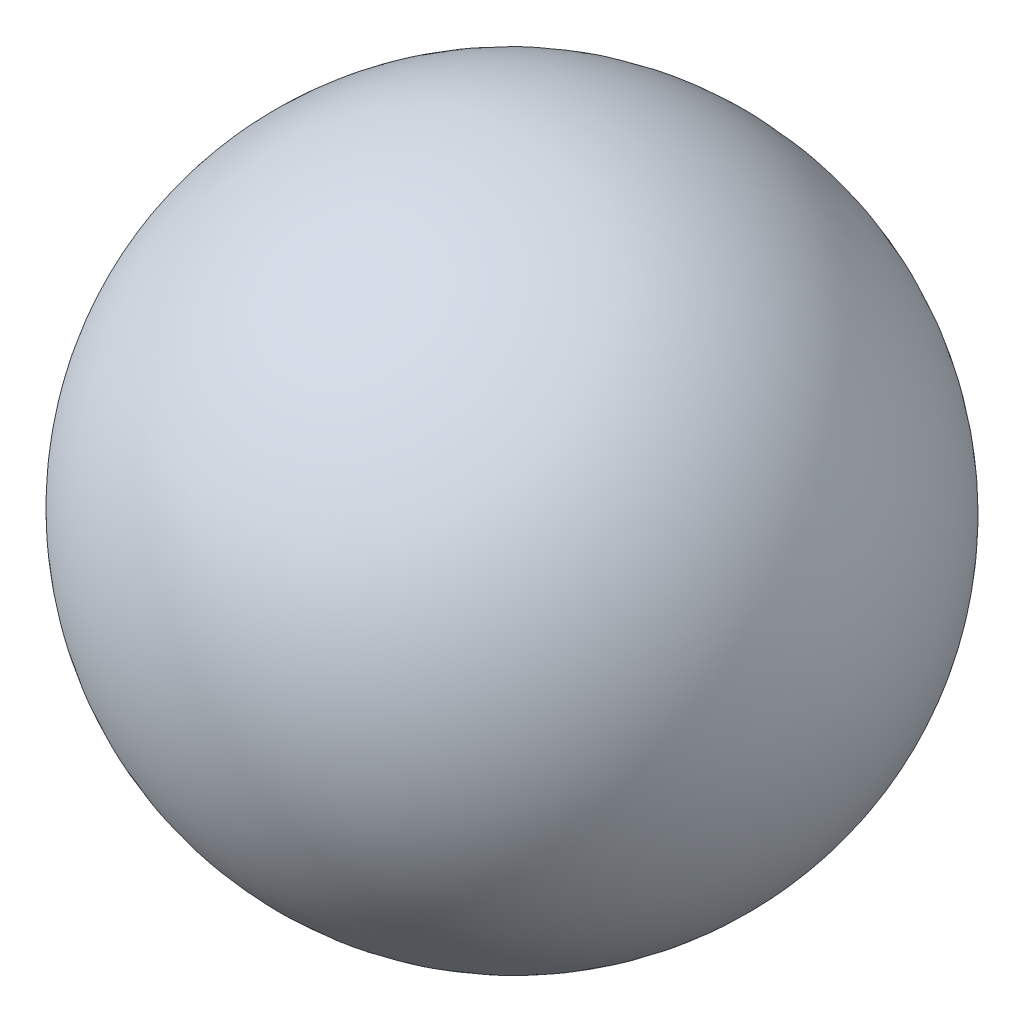
ISO-10303-21;
HEADER;
FILE_DESCRIPTION(('STEP AP214'),'2;1');
FILE_NAME('part.step','',(''),(''),'','','');
FILE_SCHEMA(('AUTOMOTIVE_DESIGN { 1 0 10303 214 1 1 1 1 }'));
ENDSEC;
DATA;
#1=APPLICATION_CONTEXT('core data for automotive mechanical design processes');
#2=APPLICATION_PROTOCOL_DEFINITION('international standard','automotive_design',2000,#1);
#3=PRODUCT_CONTEXT('',#1,'mechanical');
#4=PRODUCT('Part','Part','',(#3));
#5=PRODUCT_RELATED_PRODUCT_CATEGORY('part','',(#4));
#6=PRODUCT_DEFINITION_FORMATION('','',#4);
#7=PRODUCT_DEFINITION_CONTEXT('part definition',#1,'design');
#8=PRODUCT_DEFINITION('design','',#6,#7);
#9=PRODUCT_DEFINITION_SHAPE('','',#8);
#10=(LENGTH_UNIT() NAMED_UNIT(*) SI_UNIT(.MILLI.,.METRE.));
#11=(NAMED_UNIT(*) PLANE_ANGLE_UNIT() SI_UNIT($,.RADIAN.));
#12=(NAMED_UNIT(*) SI_UNIT($,.STERADIAN.) SOLID_ANGLE_UNIT());
#13=UNCERTAINTY_MEASURE_WITH_UNIT(LENGTH_MEASURE(1.E-05),#10,'distance_accuracy_value','');
#14=(GEOMETRIC_REPRESENTATION_CONTEXT(3) GLOBAL_UNCERTAINTY_ASSIGNED_CONTEXT((#13)) GLOBAL_UNIT_ASSIGNED_CONTEXT((#10,
#11,#12)) REPRESENTATION_CONTEXT('',''));
#15=CARTESIAN_POINT('',(0.,0.,0.));
#16=DIRECTION('',(0.,0.,1.));
#17=DIRECTION('',(1.,0.,0.));
#18=AXIS2_PLACEMENT_3D('',#15,#16,#17);
#19=CARTESIAN_POINT('',(0.,0.,0.));
#20=DIRECTION('',(0.,0.,-1.));
#21=DIRECTION('',(-0.0129989016392152,-0.999915510708867,0.));
#22=AXIS2_PLACEMENT_3D('',#19,#20,#21);
#23=CIRCLE('',#22,12.);
#24=TRIMMED_CURVE('',#23,(PARAMETER_VALUE(-1.55481763043133)),
(PARAMETER_VALUE(1.55481763043133)),.T.,.PARAMETER.);
#25=CARTESIAN_POINT('',(-0.00249235996737165,-0.191719997490475,0.));
#26=DIRECTION('',(-0.999915510708867,0.0129989016392152,0.));
#27=AXIS1_PLACEMENT('',#25,#26);
#28=SURFACE_OF_REVOLUTION('',#24,#27);
#29=CARTESIAN_POINT('',(11.9949620181351,-0.347686904405807,0.));
#30=VERTEX_POINT('',#29);
#31=VERTEX_LOOP('',#30);
#32=FACE_BOUND('',#31,.T.);
#33=CARTESIAN_POINT('',(-11.9999467380699,-0.0357530905751432,0.));
#34=VERTEX_POINT('',#33);
#35=VERTEX_LOOP('',#34);
#36=FACE_BOUND('',#35,.T.);
#37=ADVANCED_FACE('F31',(#32,#36),#28,.T.);
#38=CLOSED_SHELL('',(#37));
#39=MANIFOLD_SOLID_BREP('B2',#38);
#40=ADVANCED_BREP_SHAPE_REPRESENTATION('',(#18,#39),#14);
#41=SHAPE_DEFINITION_REPRESENTATION(#9,#40);
ENDSEC;
END-ISO-10303-21;
